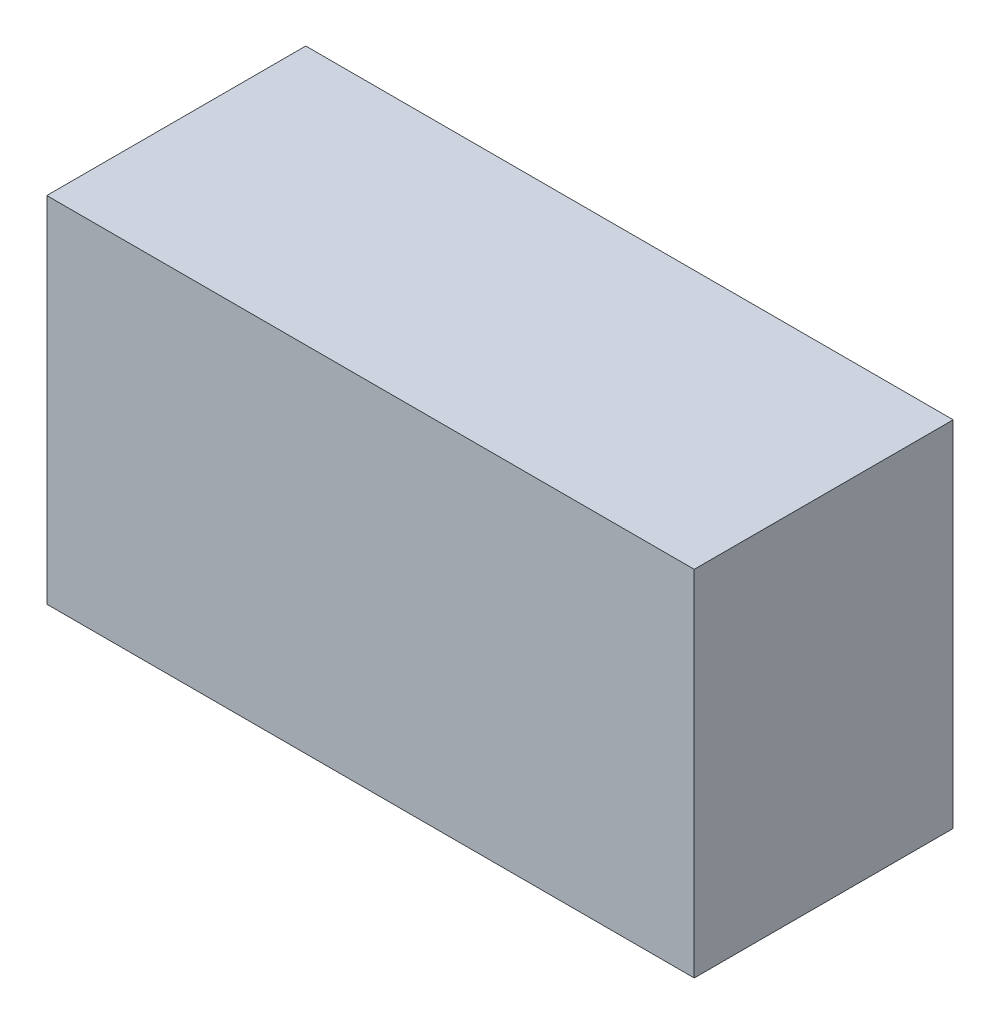
ISO-10303-21;
HEADER;
FILE_DESCRIPTION(('STEP AP214'),'2;1');
FILE_NAME('part.step','',(''),(''),'','','');
FILE_SCHEMA(('AUTOMOTIVE_DESIGN { 1 0 10303 214 1 1 1 1 }'));
ENDSEC;
DATA;
#1=APPLICATION_CONTEXT('core data for automotive mechanical design processes');
#2=APPLICATION_PROTOCOL_DEFINITION('international standard','automotive_design',2000,#1);
#3=PRODUCT_CONTEXT('',#1,'mechanical');
#4=PRODUCT('Part','Part','',(#3));
#5=PRODUCT_RELATED_PRODUCT_CATEGORY('part','',(#4));
#6=PRODUCT_DEFINITION_FORMATION('','',#4);
#7=PRODUCT_DEFINITION_CONTEXT('part definition',#1,'design');
#8=PRODUCT_DEFINITION('design','',#6,#7);
#9=PRODUCT_DEFINITION_SHAPE('','',#8);
#10=(LENGTH_UNIT() NAMED_UNIT(*) SI_UNIT(.MILLI.,.METRE.));
#11=(NAMED_UNIT(*) PLANE_ANGLE_UNIT() SI_UNIT($,.RADIAN.));
#12=(NAMED_UNIT(*) SI_UNIT($,.STERADIAN.) SOLID_ANGLE_UNIT());
#13=UNCERTAINTY_MEASURE_WITH_UNIT(LENGTH_MEASURE(1.E-05),#10,'distance_accuracy_value','');
#14=(GEOMETRIC_REPRESENTATION_CONTEXT(3) GLOBAL_UNCERTAINTY_ASSIGNED_CONTEXT((#13)) GLOBAL_UNIT_ASSIGNED_CONTEXT((#10,
#11,#12)) REPRESENTATION_CONTEXT('',''));
#15=CARTESIAN_POINT('',(0.,0.,0.));
#16=DIRECTION('',(0.,0.,1.));
#17=DIRECTION('',(1.,0.,0.));
#18=AXIS2_PLACEMENT_3D('',#15,#16,#17);
#19=CARTESIAN_POINT('',(-37.5,-20.5,30.));
#20=DIRECTION('',(1.,0.,0.));
#21=DIRECTION('',(0.,0.,-1.));
#22=AXIS2_PLACEMENT_3D('',#19,#20,#21);
#23=PLANE('',#22);
#24=DIRECTION('',(0.,-1.,0.));
#25=VECTOR('',#24,1.);
#26=CARTESIAN_POINT('',(-37.5,-20.5,0.));
#27=LINE('',#26,#25);
#28=CARTESIAN_POINT('',(-37.5,20.5,0.));
#29=VERTEX_POINT('',#28);
#30=CARTESIAN_POINT('',(-37.5,-20.5,0.));
#31=VERTEX_POINT('',#30);
#32=EDGE_CURVE('E113',#29,#31,#27,.T.);
#33=ORIENTED_EDGE('',*,*,#32,.T.);
#34=DIRECTION('',(0.,0.,-1.));
#35=VECTOR('',#34,1.);
#36=CARTESIAN_POINT('',(-37.5,-20.5,30.));
#37=LINE('',#36,#35);
#38=CARTESIAN_POINT('',(-37.5,-20.5,30.));
#39=VERTEX_POINT('',#38);
#40=EDGE_CURVE('E11',#39,#31,#37,.T.);
#41=ORIENTED_EDGE('',*,*,#40,.F.);
#42=DIRECTION('',(0.,-1.,0.));
#43=VECTOR('',#42,1.);
#44=CARTESIAN_POINT('',(-37.5,-20.5,30.));
#45=LINE('',#44,#43);
#46=CARTESIAN_POINT('',(-37.5,20.5,30.));
#47=VERTEX_POINT('',#46);
#48=EDGE_CURVE('E97',#47,#39,#45,.T.);
#49=ORIENTED_EDGE('',*,*,#48,.F.);
#50=DIRECTION('',(0.,0.,-1.));
#51=VECTOR('',#50,1.);
#52=CARTESIAN_POINT('',(-37.5,20.5,30.));
#53=LINE('',#52,#51);
#54=EDGE_CURVE('E109',#47,#29,#53,.T.);
#55=ORIENTED_EDGE('',*,*,#54,.T.);
#56=EDGE_LOOP('',(#33,#41,#49,#55));
#57=FACE_BOUND('',#56,.T.);
#58=ADVANCED_FACE('F45',(#57),#23,.F.);
#59=CARTESIAN_POINT('',(37.5,-20.5,30.));
#60=DIRECTION('',(0.,1.,0.));
#61=DIRECTION('',(-1.,0.,0.));
#62=AXIS2_PLACEMENT_3D('',#59,#60,#61);
#63=PLANE('',#62);
#64=DIRECTION('',(1.,0.,0.));
#65=VECTOR('',#64,1.);
#66=CARTESIAN_POINT('',(37.5,-20.5,0.));
#67=LINE('',#66,#65);
#68=CARTESIAN_POINT('',(37.5,-20.5,0.));
#69=VERTEX_POINT('',#68);
#70=EDGE_CURVE('E102',#31,#69,#67,.T.);
#71=ORIENTED_EDGE('',*,*,#70,.T.);
#72=DIRECTION('',(0.,0.,-1.));
#73=VECTOR('',#72,1.);
#74=CARTESIAN_POINT('',(37.5,-20.5,30.));
#75=LINE('',#74,#73);
#76=CARTESIAN_POINT('',(37.5,-20.5,30.));
#77=VERTEX_POINT('',#76);
#78=EDGE_CURVE('E54',#77,#69,#75,.T.);
#79=ORIENTED_EDGE('',*,*,#78,.F.);
#80=DIRECTION('',(1.,0.,0.));
#81=VECTOR('',#80,1.);
#82=CARTESIAN_POINT('',(37.5,-20.5,30.));
#83=LINE('',#82,#81);
#84=EDGE_CURVE('E92',#39,#77,#83,.T.);
#85=ORIENTED_EDGE('',*,*,#84,.F.);
#86=ORIENTED_EDGE('',*,*,#40,.T.);
#87=EDGE_LOOP('',(#71,#79,#85,#86));
#88=FACE_BOUND('',#87,.T.);
#89=ADVANCED_FACE('F101',(#88),#63,.F.);
#90=CARTESIAN_POINT('',(37.5,-20.5,30.));
#91=DIRECTION('',(-1.,0.,0.));
#92=DIRECTION('',(0.,0.,1.));
#93=AXIS2_PLACEMENT_3D('',#90,#91,#92);
#94=PLANE('',#93);
#95=DIRECTION('',(0.,1.,0.));
#96=VECTOR('',#95,1.);
#97=CARTESIAN_POINT('',(37.5,-20.5,0.));
#98=LINE('',#97,#96);
#99=CARTESIAN_POINT('',(37.5,20.5,0.));
#100=VERTEX_POINT('',#99);
#101=EDGE_CURVE('E79',#69,#100,#98,.T.);
#102=ORIENTED_EDGE('',*,*,#101,.T.);
#103=DIRECTION('',(0.,0.,-1.));
#104=VECTOR('',#103,1.);
#105=CARTESIAN_POINT('',(37.5,20.5,30.));
#106=LINE('',#105,#104);
#107=CARTESIAN_POINT('',(37.5,20.5,30.));
#108=VERTEX_POINT('',#107);
#109=EDGE_CURVE('E104',#108,#100,#106,.T.);
#110=ORIENTED_EDGE('',*,*,#109,.F.);
#111=DIRECTION('',(0.,1.,0.));
#112=VECTOR('',#111,1.);
#113=CARTESIAN_POINT('',(37.5,-20.5,30.));
#114=LINE('',#113,#112);
#115=EDGE_CURVE('E95',#77,#108,#114,.T.);
#116=ORIENTED_EDGE('',*,*,#115,.F.);
#117=ORIENTED_EDGE('',*,*,#78,.T.);
#118=EDGE_LOOP('',(#102,#110,#116,#117));
#119=FACE_BOUND('',#118,.T.);
#120=ADVANCED_FACE('F105',(#119),#94,.F.);
#121=CARTESIAN_POINT('',(37.5,20.5,30.));
#122=DIRECTION('',(0.,-1.,0.));
#123=DIRECTION('',(1.,0.,0.));
#124=AXIS2_PLACEMENT_3D('',#121,#122,#123);
#125=PLANE('',#124);
#126=DIRECTION('',(-1.,0.,0.));
#127=VECTOR('',#126,1.);
#128=CARTESIAN_POINT('',(37.5,20.5,0.));
#129=LINE('',#128,#127);
#130=EDGE_CURVE('E85',#100,#29,#129,.T.);
#131=ORIENTED_EDGE('',*,*,#130,.T.);
#132=ORIENTED_EDGE('',*,*,#54,.F.);
#133=DIRECTION('',(-1.,0.,0.));
#134=VECTOR('',#133,1.);
#135=CARTESIAN_POINT('',(37.5,20.5,30.));
#136=LINE('',#135,#134);
#137=EDGE_CURVE('E62',#108,#47,#136,.T.);
#138=ORIENTED_EDGE('',*,*,#137,.F.);
#139=ORIENTED_EDGE('',*,*,#109,.T.);
#140=EDGE_LOOP('',(#131,#132,#138,#139));
#141=FACE_BOUND('',#140,.T.);
#142=ADVANCED_FACE('F126',(#141),#125,.F.);
#143=CARTESIAN_POINT('',(0.,0.,30.));
#144=DIRECTION('',(0.,0.,1.));
#145=DIRECTION('',(1.,0.,0.));
#146=AXIS2_PLACEMENT_3D('',#143,#144,#145);
#147=PLANE('',#146);
#148=ORIENTED_EDGE('',*,*,#48,.T.);
#149=ORIENTED_EDGE('',*,*,#84,.T.);
#150=ORIENTED_EDGE('',*,*,#115,.T.);
#151=ORIENTED_EDGE('',*,*,#137,.T.);
#152=EDGE_LOOP('',(#148,#149,#150,#151));
#153=FACE_BOUND('',#152,.T.);
#154=ADVANCED_FACE('F93',(#153),#147,.T.);
#155=CARTESIAN_POINT('',(0.,0.,0.));
#156=DIRECTION('',(0.,0.,1.));
#157=DIRECTION('',(1.,0.,0.));
#158=AXIS2_PLACEMENT_3D('',#155,#156,#157);
#159=PLANE('',#158);
#160=ORIENTED_EDGE('',*,*,#32,.F.);
#161=ORIENTED_EDGE('',*,*,#130,.F.);
#162=ORIENTED_EDGE('',*,*,#101,.F.);
#163=ORIENTED_EDGE('',*,*,#70,.F.);
#164=EDGE_LOOP('',(#160,#161,#162,#163));
#165=FACE_BOUND('',#164,.T.);
#166=ADVANCED_FACE('F129',(#165),#159,.F.);
#167=CLOSED_SHELL('',(#58,#89,#120,#142,#154,#166));
#168=MANIFOLD_SOLID_BREP('B2',#167);
#169=ADVANCED_BREP_SHAPE_REPRESENTATION('',(#18,#168),#14);
#170=SHAPE_DEFINITION_REPRESENTATION(#9,#169);
ENDSEC;
END-ISO-10303-21;
